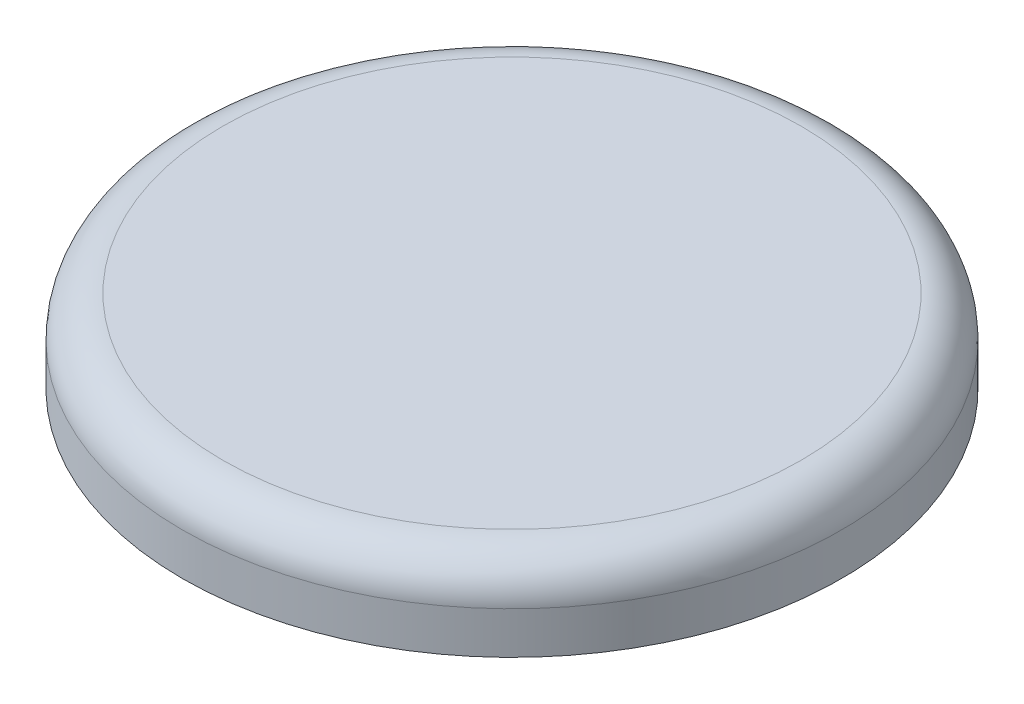
ISO-10303-21;
HEADER;
FILE_DESCRIPTION(('STEP AP214'),'2;1');
FILE_NAME('part.step','',(''),(''),'','','');
FILE_SCHEMA(('AUTOMOTIVE_DESIGN { 1 0 10303 214 1 1 1 1 }'));
ENDSEC;
DATA;
#1=APPLICATION_CONTEXT('core data for automotive mechanical design processes');
#2=APPLICATION_PROTOCOL_DEFINITION('international standard','automotive_design',2000,#1);
#3=PRODUCT_CONTEXT('',#1,'mechanical');
#4=PRODUCT('Part','Part','',(#3));
#5=PRODUCT_RELATED_PRODUCT_CATEGORY('part','',(#4));
#6=PRODUCT_DEFINITION_FORMATION('','',#4);
#7=PRODUCT_DEFINITION_CONTEXT('part definition',#1,'design');
#8=PRODUCT_DEFINITION('design','',#6,#7);
#9=PRODUCT_DEFINITION_SHAPE('','',#8);
#10=(LENGTH_UNIT() NAMED_UNIT(*) SI_UNIT(.MILLI.,.METRE.));
#11=(NAMED_UNIT(*) PLANE_ANGLE_UNIT() SI_UNIT($,.RADIAN.));
#12=(NAMED_UNIT(*) SI_UNIT($,.STERADIAN.) SOLID_ANGLE_UNIT());
#13=UNCERTAINTY_MEASURE_WITH_UNIT(LENGTH_MEASURE(1.E-05),#10,'distance_accuracy_value','');
#14=(GEOMETRIC_REPRESENTATION_CONTEXT(3) GLOBAL_UNCERTAINTY_ASSIGNED_CONTEXT((#13)) GLOBAL_UNIT_ASSIGNED_CONTEXT((#10,
#11,#12)) REPRESENTATION_CONTEXT('',''));
#15=CARTESIAN_POINT('',(0.,0.,0.));
#16=DIRECTION('',(0.,0.,1.));
#17=DIRECTION('',(1.,0.,0.));
#18=AXIS2_PLACEMENT_3D('',#15,#16,#17);
#19=CARTESIAN_POINT('',(0.,5.07999999999999,0.));
#20=DIRECTION('',(0.,-1.,0.));
#21=DIRECTION('',(0.,0.,-1.));
#22=AXIS2_PLACEMENT_3D('',#19,#20,#21);
#23=PLANE('',#22);
#24=CARTESIAN_POINT('',(0.,5.07999999999998,0.));
#25=DIRECTION('',(0.,-1.,0.));
#26=DIRECTION('',(0.,0.,-1.));
#27=AXIS2_PLACEMENT_3D('',#24,#25,#26);
#28=CIRCLE('',#27,100.33);
#29=CARTESIAN_POINT('',(0.,5.07999999999998,-100.33));
#30=VERTEX_POINT('',#29);
#31=EDGE_CURVE('E10',#30,#30,#28,.T.);
#32=ORIENTED_EDGE('',*,*,#31,.F.);
#33=EDGE_LOOP('',(#32));
#34=FACE_BOUND('',#33,.T.);
#35=ADVANCED_FACE('F35',(#34),#23,.F.);
#36=CARTESIAN_POINT('',(0.,-8.89000000000001,0.));
#37=DIRECTION('',(0.,-1.,0.));
#38=DIRECTION('',(0.,0.,-1.));
#39=AXIS2_PLACEMENT_3D('',#36,#37,#38);
#40=TOROIDAL_SURFACE('',#39,100.33,13.97);
#41=CARTESIAN_POINT('',(0.,-8.89000000000001,0.));
#42=DIRECTION('',(0.,-1.,0.));
#43=DIRECTION('',(0.,0.,-1.));
#44=AXIS2_PLACEMENT_3D('',#41,#42,#43);
#45=CIRCLE('',#44,114.3);
#46=CARTESIAN_POINT('',(0.,-8.89000000000001,-114.3));
#47=VERTEX_POINT('',#46);
#48=EDGE_CURVE('E41',#47,#47,#45,.T.);
#49=ORIENTED_EDGE('',*,*,#48,.F.);
#50=EDGE_LOOP('',(#49));
#51=FACE_BOUND('',#50,.T.);
#52=ORIENTED_EDGE('',*,*,#31,.T.);
#53=EDGE_LOOP('',(#52));
#54=FACE_BOUND('',#53,.T.);
#55=ADVANCED_FACE('F101',(#51,#54),#40,.T.);
#56=CARTESIAN_POINT('',(0.,0.,0.));
#57=DIRECTION('',(0.,-1.,0.));
#58=DIRECTION('',(0.,0.,-1.));
#59=AXIS2_PLACEMENT_3D('',#56,#57,#58);
#60=CYLINDRICAL_SURFACE('',#59,114.3);
#61=CARTESIAN_POINT('',(0.,-23.495,0.));
#62=DIRECTION('',(0.,-1.,0.));
#63=DIRECTION('',(0.,0.,-1.));
#64=AXIS2_PLACEMENT_3D('',#61,#62,#63);
#65=CIRCLE('',#64,114.3);
#66=CARTESIAN_POINT('',(0.,-23.495,-114.3));
#67=VERTEX_POINT('',#66);
#68=EDGE_CURVE('E45',#67,#67,#65,.T.);
#69=ORIENTED_EDGE('',*,*,#68,.F.);
#70=EDGE_LOOP('',(#69));
#71=FACE_BOUND('',#70,.T.);
#72=ORIENTED_EDGE('',*,*,#48,.T.);
#73=EDGE_LOOP('',(#72));
#74=FACE_BOUND('',#73,.T.);
#75=ADVANCED_FACE('F96',(#71,#74),#60,.T.);
#76=CARTESIAN_POINT('',(-111.76,-23.495,0.));
#77=DIRECTION('',(0.,1.,0.));
#78=DIRECTION('',(0.,0.,1.));
#79=AXIS2_PLACEMENT_3D('',#76,#77,#78);
#80=PLANE('',#79);
#81=CARTESIAN_POINT('',(0.,-23.495,0.));
#82=DIRECTION('',(0.,-1.,0.));
#83=DIRECTION('',(0.,0.,-1.));
#84=AXIS2_PLACEMENT_3D('',#81,#82,#83);
#85=CIRCLE('',#84,111.76);
#86=CARTESIAN_POINT('',(0.,-23.495,-111.76));
#87=VERTEX_POINT('',#86);
#88=EDGE_CURVE('E49',#87,#87,#85,.T.);
#89=ORIENTED_EDGE('',*,*,#88,.F.);
#90=EDGE_LOOP('',(#89));
#91=FACE_BOUND('',#90,.T.);
#92=ORIENTED_EDGE('',*,*,#68,.T.);
#93=EDGE_LOOP('',(#92));
#94=FACE_BOUND('',#93,.T.);
#95=ADVANCED_FACE('F90',(#91,#94),#80,.F.);
#96=CARTESIAN_POINT('',(0.,0.,0.));
#97=DIRECTION('',(0.,-1.,0.));
#98=DIRECTION('',(0.,0.,-1.));
#99=AXIS2_PLACEMENT_3D('',#96,#97,#98);
#100=CYLINDRICAL_SURFACE('',#99,111.76);
#101=CARTESIAN_POINT('',(0.,-10.795,0.));
#102=DIRECTION('',(0.,-1.,0.));
#103=DIRECTION('',(0.,0.,-1.));
#104=AXIS2_PLACEMENT_3D('',#101,#102,#103);
#105=CIRCLE('',#104,111.76);
#106=CARTESIAN_POINT('',(0.,-10.795,-111.76));
#107=VERTEX_POINT('',#106);
#108=EDGE_CURVE('E54',#107,#107,#105,.T.);
#109=ORIENTED_EDGE('',*,*,#108,.F.);
#110=EDGE_LOOP('',(#109));
#111=FACE_BOUND('',#110,.T.);
#112=ORIENTED_EDGE('',*,*,#88,.T.);
#113=EDGE_LOOP('',(#112));
#114=FACE_BOUND('',#113,.T.);
#115=ADVANCED_FACE('F84',(#111,#114),#100,.F.);
#116=CARTESIAN_POINT('',(-109.22,-10.795,0.));
#117=DIRECTION('',(0.,1.,0.));
#118=DIRECTION('',(0.,0.,1.));
#119=AXIS2_PLACEMENT_3D('',#116,#117,#118);
#120=PLANE('',#119);
#121=CARTESIAN_POINT('',(0.,-10.795,0.));
#122=DIRECTION('',(0.,-1.,0.));
#123=DIRECTION('',(0.,0.,-1.));
#124=AXIS2_PLACEMENT_3D('',#121,#122,#123);
#125=CIRCLE('',#124,109.22);
#126=CARTESIAN_POINT('',(0.,-10.795,-109.22));
#127=VERTEX_POINT('',#126);
#128=EDGE_CURVE('E57',#127,#127,#125,.T.);
#129=ORIENTED_EDGE('',*,*,#128,.F.);
#130=EDGE_LOOP('',(#129));
#131=FACE_BOUND('',#130,.T.);
#132=ORIENTED_EDGE('',*,*,#108,.T.);
#133=EDGE_LOOP('',(#132));
#134=FACE_BOUND('',#133,.T.);
#135=ADVANCED_FACE('F78',(#131,#134),#120,.F.);
#136=CARTESIAN_POINT('',(0.,0.,0.));
#137=DIRECTION('',(0.,-1.,0.));
#138=DIRECTION('',(0.,0.,-1.));
#139=AXIS2_PLACEMENT_3D('',#136,#137,#138);
#140=CYLINDRICAL_SURFACE('',#139,109.22);
#141=CARTESIAN_POINT('',(0.,-8.89000000000001,0.));
#142=DIRECTION('',(0.,-1.,0.));
#143=DIRECTION('',(0.,0.,-1.));
#144=AXIS2_PLACEMENT_3D('',#141,#142,#143);
#145=CIRCLE('',#144,109.22);
#146=CARTESIAN_POINT('',(0.,-8.89000000000001,-109.22));
#147=VERTEX_POINT('',#146);
#148=EDGE_CURVE('E60',#147,#147,#145,.T.);
#149=ORIENTED_EDGE('',*,*,#148,.F.);
#150=EDGE_LOOP('',(#149));
#151=FACE_BOUND('',#150,.T.);
#152=ORIENTED_EDGE('',*,*,#128,.T.);
#153=EDGE_LOOP('',(#152));
#154=FACE_BOUND('',#153,.T.);
#155=ADVANCED_FACE('F72',(#151,#154),#140,.F.);
#156=CARTESIAN_POINT('',(0.,-8.89000000000001,0.));
#157=DIRECTION('',(0.,-1.,0.));
#158=DIRECTION('',(0.,0.,-1.));
#159=AXIS2_PLACEMENT_3D('',#156,#157,#158);
#160=TOROIDAL_SURFACE('',#159,100.33,8.88999999999999);
#161=CARTESIAN_POINT('',(0.,0.,0.));
#162=DIRECTION('',(0.,-1.,0.));
#163=DIRECTION('',(0.,0.,-1.));
#164=AXIS2_PLACEMENT_3D('',#161,#162,#163);
#165=CIRCLE('',#164,100.33);
#166=CARTESIAN_POINT('',(0.,0.,-100.33));
#167=VERTEX_POINT('',#166);
#168=EDGE_CURVE('E63',#167,#167,#165,.T.);
#169=ORIENTED_EDGE('',*,*,#168,.F.);
#170=EDGE_LOOP('',(#169));
#171=FACE_BOUND('',#170,.T.);
#172=ORIENTED_EDGE('',*,*,#148,.T.);
#173=EDGE_LOOP('',(#172));
#174=FACE_BOUND('',#173,.T.);
#175=ADVANCED_FACE('F69',(#171,#174),#160,.F.);
#176=CARTESIAN_POINT('',(0.,0.,0.));
#177=DIRECTION('',(0.,1.,0.));
#178=DIRECTION('',(0.,0.,1.));
#179=AXIS2_PLACEMENT_3D('',#176,#177,#178);
#180=PLANE('',#179);
#181=ORIENTED_EDGE('',*,*,#168,.T.);
#182=EDGE_LOOP('',(#181));
#183=FACE_BOUND('',#182,.T.);
#184=ADVANCED_FACE('F67',(#183),#180,.F.);
#185=CLOSED_SHELL('',(#35,#55,#75,#95,#115,#135,#155,#175,#184));
#186=MANIFOLD_SOLID_BREP('B2',#185);
#187=ADVANCED_BREP_SHAPE_REPRESENTATION('',(#18,#186),#14);
#188=SHAPE_DEFINITION_REPRESENTATION(#9,#187);
ENDSEC;
END-ISO-10303-21;
